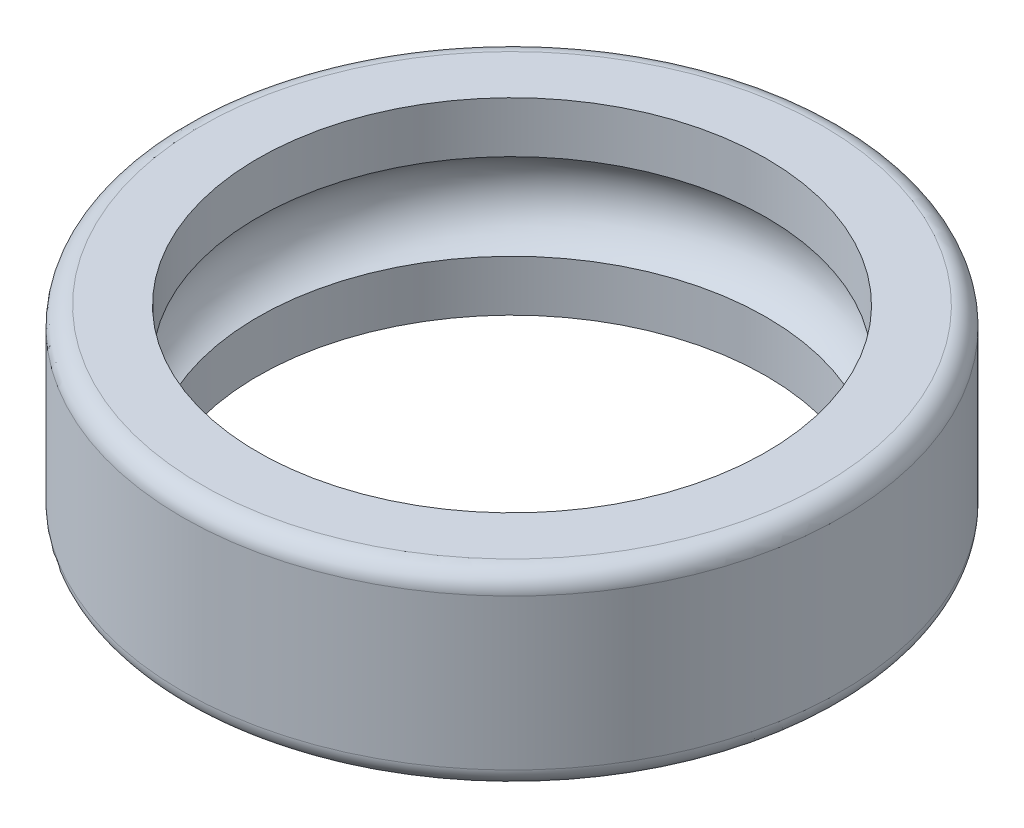
ISO-10303-21;
HEADER;
FILE_DESCRIPTION(('STEP AP214'),'2;1');
FILE_NAME('part.step','',(''),(''),'','','');
FILE_SCHEMA(('AUTOMOTIVE_DESIGN { 1 0 10303 214 1 1 1 1 }'));
ENDSEC;
DATA;
#1=APPLICATION_CONTEXT('core data for automotive mechanical design processes');
#2=APPLICATION_PROTOCOL_DEFINITION('international standard','automotive_design',2000,#1);
#3=PRODUCT_CONTEXT('',#1,'mechanical');
#4=PRODUCT('Part','Part','',(#3));
#5=PRODUCT_RELATED_PRODUCT_CATEGORY('part','',(#4));
#6=PRODUCT_DEFINITION_FORMATION('','',#4);
#7=PRODUCT_DEFINITION_CONTEXT('part definition',#1,'design');
#8=PRODUCT_DEFINITION('design','',#6,#7);
#9=PRODUCT_DEFINITION_SHAPE('','',#8);
#10=(LENGTH_UNIT() NAMED_UNIT(*) SI_UNIT(.MILLI.,.METRE.));
#11=(NAMED_UNIT(*) PLANE_ANGLE_UNIT() SI_UNIT($,.RADIAN.));
#12=(NAMED_UNIT(*) SI_UNIT($,.STERADIAN.) SOLID_ANGLE_UNIT());
#13=UNCERTAINTY_MEASURE_WITH_UNIT(LENGTH_MEASURE(1.E-05),#10,'distance_accuracy_value','');
#14=(GEOMETRIC_REPRESENTATION_CONTEXT(3) GLOBAL_UNCERTAINTY_ASSIGNED_CONTEXT((#13)) GLOBAL_UNIT_ASSIGNED_CONTEXT((#10,
#11,#12)) REPRESENTATION_CONTEXT('',''));
#15=CARTESIAN_POINT('',(0.,0.,0.));
#16=DIRECTION('',(0.,0.,1.));
#17=DIRECTION('',(1.,0.,0.));
#18=AXIS2_PLACEMENT_3D('',#15,#16,#17);
#19=CARTESIAN_POINT('',(0.,-30.4352843281218,0.));
#20=DIRECTION('',(0.,-1.,0.));
#21=DIRECTION('',(0.,0.,-1.));
#22=AXIS2_PLACEMENT_3D('',#19,#20,#21);
#23=CYLINDRICAL_SURFACE('',#22,13.5);
#24=CARTESIAN_POINT('',(0.,-2.29128784747792,0.));
#25=DIRECTION('',(0.,-1.,0.));
#26=DIRECTION('',(0.,0.,-1.));
#27=AXIS2_PLACEMENT_3D('',#24,#25,#26);
#28=CIRCLE('',#27,13.5);
#29=CARTESIAN_POINT('',(0.,-2.29128784747792,-13.5));
#30=VERTEX_POINT('',#29);
#31=EDGE_CURVE('E10',#30,#30,#28,.T.);
#32=ORIENTED_EDGE('',*,*,#31,.F.);
#33=EDGE_LOOP('',(#32));
#34=FACE_BOUND('',#33,.T.);
#35=CARTESIAN_POINT('',(0.,-5.,0.));
#36=DIRECTION('',(0.,-1.,0.));
#37=DIRECTION('',(0.,0.,-1.));
#38=AXIS2_PLACEMENT_3D('',#35,#36,#37);
#39=CIRCLE('',#38,13.5);
#40=CARTESIAN_POINT('',(0.,-5.,-13.5));
#41=VERTEX_POINT('',#40);
#42=EDGE_CURVE('E65',#41,#41,#39,.T.);
#43=ORIENTED_EDGE('',*,*,#42,.T.);
#44=EDGE_LOOP('',(#43));
#45=FACE_BOUND('',#44,.T.);
#46=ADVANCED_FACE('F37',(#34,#45),#23,.F.);
#47=CARTESIAN_POINT('',(0.,0.,0.));
#48=DIRECTION('',(0.,-1.,0.));
#49=DIRECTION('',(0.,0.,-1.));
#50=AXIS2_PLACEMENT_3D('',#47,#48,#49);
#51=TOROIDAL_SURFACE('',#50,12.5,2.5);
#52=CARTESIAN_POINT('',(0.,2.29128784747792,0.));
#53=DIRECTION('',(0.,-1.,0.));
#54=DIRECTION('',(0.,0.,-1.));
#55=AXIS2_PLACEMENT_3D('',#52,#53,#54);
#56=CIRCLE('',#55,13.5);
#57=CARTESIAN_POINT('',(0.,2.29128784747792,-13.5));
#58=VERTEX_POINT('',#57);
#59=EDGE_CURVE('E43',#58,#58,#56,.T.);
#60=ORIENTED_EDGE('',*,*,#59,.F.);
#61=EDGE_LOOP('',(#60));
#62=FACE_BOUND('',#61,.T.);
#63=ORIENTED_EDGE('',*,*,#31,.T.);
#64=EDGE_LOOP('',(#63));
#65=FACE_BOUND('',#64,.T.);
#66=ADVANCED_FACE('F102',(#62,#65),#51,.F.);
#67=CARTESIAN_POINT('',(0.,-30.4352843281218,0.));
#68=DIRECTION('',(0.,-1.,0.));
#69=DIRECTION('',(0.,0.,-1.));
#70=AXIS2_PLACEMENT_3D('',#67,#68,#69);
#71=CYLINDRICAL_SURFACE('',#70,13.5);
#72=CARTESIAN_POINT('',(0.,5.,0.));
#73=DIRECTION('',(0.,-1.,0.));
#74=DIRECTION('',(0.,0.,-1.));
#75=AXIS2_PLACEMENT_3D('',#72,#73,#74);
#76=CIRCLE('',#75,13.5);
#77=CARTESIAN_POINT('',(0.,5.,-13.5));
#78=VERTEX_POINT('',#77);
#79=EDGE_CURVE('E47',#78,#78,#76,.T.);
#80=ORIENTED_EDGE('',*,*,#79,.F.);
#81=EDGE_LOOP('',(#80));
#82=FACE_BOUND('',#81,.T.);
#83=ORIENTED_EDGE('',*,*,#59,.T.);
#84=EDGE_LOOP('',(#83));
#85=FACE_BOUND('',#84,.T.);
#86=ADVANCED_FACE('F97',(#82,#85),#71,.F.);
#87=CARTESIAN_POINT('',(0.,5.,16.5));
#88=DIRECTION('',(0.,-1.,0.));
#89=DIRECTION('',(0.,0.,-1.));
#90=AXIS2_PLACEMENT_3D('',#87,#88,#89);
#91=PLANE('',#90);
#92=CARTESIAN_POINT('',(0.,5.,0.));
#93=DIRECTION('',(0.,-1.,0.));
#94=DIRECTION('',(0.,0.,-1.));
#95=AXIS2_PLACEMENT_3D('',#92,#93,#94);
#96=CIRCLE('',#95,16.5);
#97=CARTESIAN_POINT('',(0.,5.,-16.5));
#98=VERTEX_POINT('',#97);
#99=EDGE_CURVE('E51',#98,#98,#96,.T.);
#100=ORIENTED_EDGE('',*,*,#99,.F.);
#101=EDGE_LOOP('',(#100));
#102=FACE_BOUND('',#101,.T.);
#103=ORIENTED_EDGE('',*,*,#79,.T.);
#104=EDGE_LOOP('',(#103));
#105=FACE_BOUND('',#104,.T.);
#106=ADVANCED_FACE('F91',(#102,#105),#91,.F.);
#107=CARTESIAN_POINT('',(0.,4.,0.));
#108=DIRECTION('',(0.,-1.,0.));
#109=DIRECTION('',(0.,0.,-1.));
#110=AXIS2_PLACEMENT_3D('',#107,#108,#109);
#111=TOROIDAL_SURFACE('',#110,16.5,1.);
#112=CARTESIAN_POINT('',(0.,3.99999999999999,0.));
#113=DIRECTION('',(0.,-1.,0.));
#114=DIRECTION('',(0.,0.,-1.));
#115=AXIS2_PLACEMENT_3D('',#112,#113,#114);
#116=CIRCLE('',#115,17.5);
#117=CARTESIAN_POINT('',(0.,3.99999999999999,-17.5));
#118=VERTEX_POINT('',#117);
#119=EDGE_CURVE('E56',#118,#118,#116,.T.);
#120=ORIENTED_EDGE('',*,*,#119,.F.);
#121=EDGE_LOOP('',(#120));
#122=FACE_BOUND('',#121,.T.);
#123=ORIENTED_EDGE('',*,*,#99,.T.);
#124=EDGE_LOOP('',(#123));
#125=FACE_BOUND('',#124,.T.);
#126=ADVANCED_FACE('F85',(#122,#125),#111,.T.);
#127=CARTESIAN_POINT('',(0.,-30.4352843281218,0.));
#128=DIRECTION('',(0.,-1.,0.));
#129=DIRECTION('',(0.,0.,-1.));
#130=AXIS2_PLACEMENT_3D('',#127,#128,#129);
#131=CYLINDRICAL_SURFACE('',#130,17.5);
#132=CARTESIAN_POINT('',(0.,-3.99999999999999,0.));
#133=DIRECTION('',(0.,-1.,0.));
#134=DIRECTION('',(0.,0.,-1.));
#135=AXIS2_PLACEMENT_3D('',#132,#133,#134);
#136=CIRCLE('',#135,17.5);
#137=CARTESIAN_POINT('',(0.,-3.99999999999999,-17.5));
#138=VERTEX_POINT('',#137);
#139=EDGE_CURVE('E59',#138,#138,#136,.T.);
#140=ORIENTED_EDGE('',*,*,#139,.F.);
#141=EDGE_LOOP('',(#140));
#142=FACE_BOUND('',#141,.T.);
#143=ORIENTED_EDGE('',*,*,#119,.T.);
#144=EDGE_LOOP('',(#143));
#145=FACE_BOUND('',#144,.T.);
#146=ADVANCED_FACE('F79',(#142,#145),#131,.T.);
#147=CARTESIAN_POINT('',(0.,-4.,0.));
#148=DIRECTION('',(0.,-1.,0.));
#149=DIRECTION('',(0.,0.,-1.));
#150=AXIS2_PLACEMENT_3D('',#147,#148,#149);
#151=TOROIDAL_SURFACE('',#150,16.5,1.);
#152=CARTESIAN_POINT('',(0.,-5.,0.));
#153=DIRECTION('',(0.,-1.,0.));
#154=DIRECTION('',(0.,0.,-1.));
#155=AXIS2_PLACEMENT_3D('',#152,#153,#154);
#156=CIRCLE('',#155,16.5);
#157=CARTESIAN_POINT('',(0.,-5.,-16.5));
#158=VERTEX_POINT('',#157);
#159=EDGE_CURVE('E62',#158,#158,#156,.T.);
#160=ORIENTED_EDGE('',*,*,#159,.F.);
#161=EDGE_LOOP('',(#160));
#162=FACE_BOUND('',#161,.T.);
#163=ORIENTED_EDGE('',*,*,#139,.T.);
#164=EDGE_LOOP('',(#163));
#165=FACE_BOUND('',#164,.T.);
#166=ADVANCED_FACE('F73',(#162,#165),#151,.T.);
#167=CARTESIAN_POINT('',(0.,-5.,16.5));
#168=DIRECTION('',(0.,1.,0.));
#169=DIRECTION('',(0.,0.,1.));
#170=AXIS2_PLACEMENT_3D('',#167,#168,#169);
#171=PLANE('',#170);
#172=ORIENTED_EDGE('',*,*,#42,.F.);
#173=EDGE_LOOP('',(#172));
#174=FACE_BOUND('',#173,.T.);
#175=ORIENTED_EDGE('',*,*,#159,.T.);
#176=EDGE_LOOP('',(#175));
#177=FACE_BOUND('',#176,.T.);
#178=ADVANCED_FACE('F70',(#174,#177),#171,.F.);
#179=CLOSED_SHELL('',(#46,#66,#86,#106,#126,#146,#166,#178));
#180=MANIFOLD_SOLID_BREP('B2',#179);
#181=ADVANCED_BREP_SHAPE_REPRESENTATION('',(#18,#180),#14);
#182=SHAPE_DEFINITION_REPRESENTATION(#9,#181);
ENDSEC;
END-ISO-10303-21;
